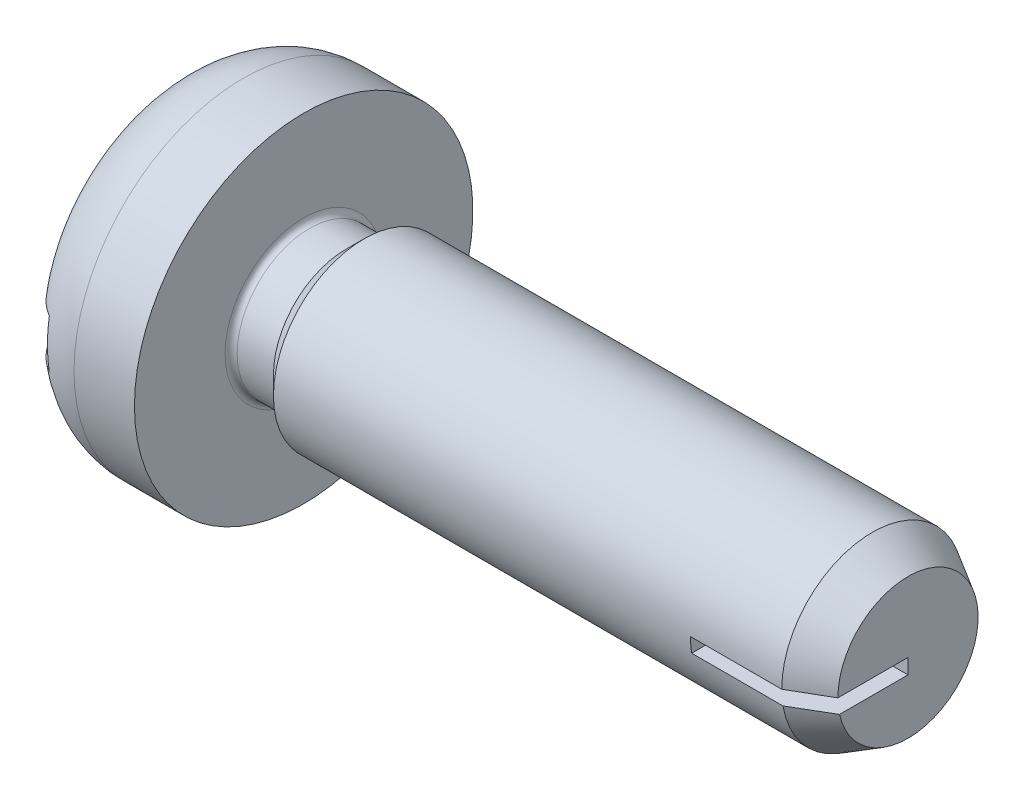
ISO-10303-21;
HEADER;
FILE_DESCRIPTION(('STEP AP214'),'2;1');
FILE_NAME('part.step','',(''),(''),'','','');
FILE_SCHEMA(('AUTOMOTIVE_DESIGN { 1 0 10303 214 1 1 1 1 }'));
ENDSEC;
DATA;
#1=APPLICATION_CONTEXT('core data for automotive mechanical design processes');
#2=APPLICATION_PROTOCOL_DEFINITION('international standard','automotive_design',2000,#1);
#3=PRODUCT_CONTEXT('',#1,'mechanical');
#4=PRODUCT('Part','Part','',(#3));
#5=PRODUCT_RELATED_PRODUCT_CATEGORY('part','',(#4));
#6=PRODUCT_DEFINITION_FORMATION('','',#4);
#7=PRODUCT_DEFINITION_CONTEXT('part definition',#1,'design');
#8=PRODUCT_DEFINITION('design','',#6,#7);
#9=PRODUCT_DEFINITION_SHAPE('','',#8);
#10=(LENGTH_UNIT() NAMED_UNIT(*) SI_UNIT(.MILLI.,.METRE.));
#11=(NAMED_UNIT(*) PLANE_ANGLE_UNIT() SI_UNIT($,.RADIAN.));
#12=(NAMED_UNIT(*) SI_UNIT($,.STERADIAN.) SOLID_ANGLE_UNIT());
#13=UNCERTAINTY_MEASURE_WITH_UNIT(LENGTH_MEASURE(1.E-05),#10,'distance_accuracy_value','');
#14=(GEOMETRIC_REPRESENTATION_CONTEXT(3) GLOBAL_UNCERTAINTY_ASSIGNED_CONTEXT((#13)) GLOBAL_UNIT_ASSIGNED_CONTEXT((#10,
#11,#12)) REPRESENTATION_CONTEXT('',''));
#15=CARTESIAN_POINT('',(0.,0.,0.));
#16=DIRECTION('',(0.,0.,1.));
#17=DIRECTION('',(1.,0.,0.));
#18=AXIS2_PLACEMENT_3D('',#15,#16,#17);
#19=CARTESIAN_POINT('',(0.,0.,0.));
#20=DIRECTION('',(-1.,0.,0.));
#21=DIRECTION('',(0.,0.,1.));
#22=AXIS2_PLACEMENT_3D('',#19,#20,#21);
#23=CYLINDRICAL_SURFACE('',#22,1.5);
#24=CARTESIAN_POINT('',(3.2,0.,0.));
#25=DIRECTION('',(-1.,0.,0.));
#26=DIRECTION('',(0.,0.,1.));
#27=AXIS2_PLACEMENT_3D('',#24,#25,#26);
#28=CIRCLE('',#27,1.5);
#29=CARTESIAN_POINT('',(3.2,0.,1.5));
#30=VERTEX_POINT('',#29);
#31=EDGE_CURVE('E176',#30,#30,#28,.T.);
#32=ORIENTED_EDGE('',*,*,#31,.F.);
#33=EDGE_LOOP('',(#32));
#34=FACE_BOUND('',#33,.T.);
#35=DIRECTION('',(-1.,0.,0.));
#36=VECTOR('',#35,1.);
#37=CARTESIAN_POINT('',(0.,0.,1.5));
#38=LINE('',#37,#36);
#39=CARTESIAN_POINT('',(11.6111027254266,0.,1.5));
#40=VERTEX_POINT('',#39);
#41=CARTESIAN_POINT('',(10.1,0.,1.5));
#42=VERTEX_POINT('',#41);
#43=EDGE_CURVE('E265',#40,#42,#38,.T.);
#44=ORIENTED_EDGE('',*,*,#43,.F.);
#45=CARTESIAN_POINT('',(11.6111027254266,0.,0.));
#46=DIRECTION('',(-1.,0.,0.));
#47=DIRECTION('',(0.,0.,1.));
#48=AXIS2_PLACEMENT_3D('',#45,#46,#47);
#49=CIRCLE('',#48,1.5);
#50=CARTESIAN_POINT('',(11.6111027254266,-0.25,1.4790199457749));
#51=VERTEX_POINT('',#50);
#52=EDGE_CURVE('E262',#40,#51,#49,.T.);
#53=ORIENTED_EDGE('',*,*,#52,.T.);
#54=DIRECTION('',(-1.,0.,0.));
#55=VECTOR('',#54,1.);
#56=CARTESIAN_POINT('',(0.,-0.250000000000002,1.4790199457749));
#57=LINE('',#56,#55);
#58=CARTESIAN_POINT('',(10.1,-0.25,1.4790199457749));
#59=VERTEX_POINT('',#58);
#60=EDGE_CURVE('E269',#59,#51,#57,.F.);
#61=ORIENTED_EDGE('',*,*,#60,.F.);
#62=CARTESIAN_POINT('',(10.1,0.,0.));
#63=DIRECTION('',(1.,0.,0.));
#64=DIRECTION('',(0.,0.,-1.));
#65=AXIS2_PLACEMENT_3D('',#62,#63,#64);
#66=CIRCLE('',#65,1.5);
#67=EDGE_CURVE('E47',#42,#59,#66,.T.);
#68=ORIENTED_EDGE('',*,*,#67,.F.);
#69=EDGE_LOOP('',(#44,#53,#61,#68));
#70=FACE_BOUND('',#69,.T.);
#71=ADVANCED_FACE('F74',(#34,#70),#23,.T.);
#72=CARTESIAN_POINT('',(11.6111027254266,0.,0.));
#73=DIRECTION('',(-1.,0.,0.));
#74=DIRECTION('',(0.,0.,1.));
#75=AXIS2_PLACEMENT_3D('',#72,#73,#74);
#76=CONICAL_SURFACE('',#75,1.5,0.523598775598292);
#77=ORIENTED_EDGE('',*,*,#52,.F.);
#78=DIRECTION('',(-0.866025403784442,0.,0.499999999999994));
#79=VECTOR('',#78,1.);
#80=CARTESIAN_POINT('',(14.2091789367799,0.,0.));
#81=LINE('',#80,#79);
#82=CARTESIAN_POINT('',(12.2,0.,1.16));
#83=VERTEX_POINT('',#82);
#84=EDGE_CURVE('E267',#40,#83,#81,.F.);
#85=ORIENTED_EDGE('',*,*,#84,.T.);
#86=CARTESIAN_POINT('',(12.2,0.,0.));
#87=DIRECTION('',(-1.,0.,0.));
#88=DIRECTION('',(0.,0.,1.));
#89=AXIS2_PLACEMENT_3D('',#86,#87,#88);
#90=CIRCLE('',#89,1.16);
#91=CARTESIAN_POINT('',(12.2,-0.25,1.13274004078606));
#92=VERTEX_POINT('',#91);
#93=EDGE_CURVE('E163',#83,#92,#90,.T.);
#94=ORIENTED_EDGE('',*,*,#93,.T.);
#95=CARTESIAN_POINT('',(13.4181418569732,-0.25,0.382203986386483));
#96=CARTESIAN_POINT('',(13.3972331951244,-0.25,0.396622432472531));
#97=CARTESIAN_POINT('',(13.3762173616021,-0.25,0.410883489403973));
#98=CARTESIAN_POINT('',(13.3340175932902,-0.25,0.439152569856273));
#99=CARTESIAN_POINT('',(13.3128336672864,-0.25,0.453160606478108));
#100=CARTESIAN_POINT('',(13.2491017012437,-0.25,0.494896164896426));
#101=CARTESIAN_POINT('',(13.2063676697051,-0.25,0.522339085516595));
#102=CARTESIAN_POINT('',(13.1206044012544,-0.25,0.576735461075967));
#103=CARTESIAN_POINT('',(13.0775752335605,-0.25,0.603689025716694));
#104=CARTESIAN_POINT('',(12.9913095492911,-0.25,0.657266142328872));
#105=CARTESIAN_POINT('',(12.9480730235488,-0.25,0.683889679520684));
#106=CARTESIAN_POINT('',(12.8218598791878,-0.25,0.761143065792754));
#107=CARTESIAN_POINT('',(12.7386947451298,-0.25,0.811464507635568));
#108=CARTESIAN_POINT('',(12.5720741029365,-0.25,0.91162472901041));
#109=CARTESIAN_POINT('',(12.488618591502,-0.25,0.961463503033985));
#110=CARTESIAN_POINT('',(12.23795252732,-0.25,1.11055290730823));
#111=CARTESIAN_POINT('',(12.0704761356872,-0.25,1.20935625450732));
#112=CARTESIAN_POINT('',(11.7752616348178,-0.25,1.3828718387951));
#113=CARTESIAN_POINT('',(11.6475908364412,-0.25,1.45769905707308));
#114=CARTESIAN_POINT('',(11.3921262060913,-0.25,1.60714336352689));
#115=CARTESIAN_POINT('',(11.2643323741095,-0.25,1.68176045168836));
#116=CARTESIAN_POINT('',(11.0087172173291,-0.25,1.83082709807698));
#117=CARTESIAN_POINT('',(10.8808959252065,-0.25,1.90527671238543));
#118=CARTESIAN_POINT('',(10.6251955577711,-0.25,2.05407620843158));
#119=CARTESIAN_POINT('',(10.4973164825464,-0.25,2.12842609032095));
#120=CARTESIAN_POINT('',(10.3694193114061,-0.25,2.20274480142775));
#121=B_SPLINE_CURVE_WITH_KNOTS('',3,(#95,#96,#97,#98,#99,#100,#101,#102,#103,#104,#105,#106,
#107,#108,#109,#110,#111,#112,#113,#114,#115,#116,#117,#118,#119,#120),.UNSPECIFIED.,.F.,.F.,(4,
2,2,2,2,2,2,2,2,2,2,2,4),(0.,0.076191962796667,0.152379969123876,0.304734924671152,
0.457055293432602,0.60938245909972,0.90099209824417,1.19260506147505,1.77594908814433,
2.2198978958494,2.66384673388621,3.10761381509469,3.55138022062236),.UNSPECIFIED.);
#122=EDGE_CURVE('E271',#92,#51,#121,.T.);
#123=ORIENTED_EDGE('',*,*,#122,.T.);
#124=EDGE_LOOP('',(#77,#85,#94,#123));
#125=FACE_BOUND('',#124,.T.);
#126=ADVANCED_FACE('F225',(#125),#76,.T.);
#127=CARTESIAN_POINT('',(12.2,1.5,0.));
#128=DIRECTION('',(-1.,0.,0.));
#129=DIRECTION('',(0.,0.,1.));
#130=AXIS2_PLACEMENT_3D('',#127,#128,#129);
#131=PLANE('',#130);
#132=DIRECTION('',(0.,0.,1.));
#133=VECTOR('',#132,1.);
#134=CARTESIAN_POINT('',(12.2,0.,0.));
#135=LINE('',#134,#133);
#136=CARTESIAN_POINT('',(12.2,0.,0.));
#137=VERTEX_POINT('',#136);
#138=EDGE_CURVE('E82',#137,#83,#135,.T.);
#139=ORIENTED_EDGE('',*,*,#138,.F.);
#140=DIRECTION('',(0.,1.,0.));
#141=VECTOR('',#140,1.);
#142=CARTESIAN_POINT('',(12.2,0.,0.));
#143=LINE('',#142,#141);
#144=CARTESIAN_POINT('',(12.2,-0.25,0.));
#145=VERTEX_POINT('',#144);
#146=EDGE_CURVE('E154',#145,#137,#143,.T.);
#147=ORIENTED_EDGE('',*,*,#146,.F.);
#148=DIRECTION('',(0.,0.,-1.));
#149=VECTOR('',#148,1.);
#150=CARTESIAN_POINT('',(12.2,-0.25,0.));
#151=LINE('',#150,#149);
#152=EDGE_CURVE('E164',#92,#145,#151,.T.);
#153=ORIENTED_EDGE('',*,*,#152,.F.);
#154=ORIENTED_EDGE('',*,*,#93,.F.);
#155=EDGE_LOOP('',(#139,#147,#153,#154));
#156=FACE_BOUND('',#155,.T.);
#157=ADVANCED_FACE('F76',(#156),#131,.F.);
#158=CARTESIAN_POINT('',(0.,0.,0.));
#159=DIRECTION('',(1.,0.,0.));
#160=DIRECTION('',(0.,0.,-1.));
#161=AXIS2_PLACEMENT_3D('',#158,#159,#160);
#162=PLANE('',#161);
#163=CARTESIAN_POINT('',(0.,0.,0.));
#164=DIRECTION('',(-1.,0.,0.));
#165=DIRECTION('',(0.,0.,1.));
#166=AXIS2_PLACEMENT_3D('',#163,#164,#165);
#167=CIRCLE('',#166,1.6);
#168=CARTESIAN_POINT('',(0.,0.4,1.54919333848297));
#169=VERTEX_POINT('',#168);
#170=CARTESIAN_POINT('',(0.,0.4,-1.54919333848297));
#171=VERTEX_POINT('',#170);
#172=EDGE_CURVE('E194',#169,#171,#167,.T.);
#173=ORIENTED_EDGE('',*,*,#172,.T.);
#174=DIRECTION('',(0.,0.,1.));
#175=VECTOR('',#174,1.);
#176=CARTESIAN_POINT('',(0.,0.4,0.));
#177=LINE('',#176,#175);
#178=EDGE_CURVE('E171',#171,#169,#177,.T.);
#179=ORIENTED_EDGE('',*,*,#178,.T.);
#180=EDGE_LOOP('',(#173,#179));
#181=FACE_BOUND('',#180,.T.);
#182=ADVANCED_FACE('F304',(#181),#162,.F.);
#183=CARTESIAN_POINT('',(3.2,0.,0.));
#184=DIRECTION('',(1.,0.,0.));
#185=DIRECTION('',(0.,0.,-1.));
#186=AXIS2_PLACEMENT_3D('',#183,#184,#185);
#187=CONICAL_SURFACE('',#186,1.5,0.78539816339745);
#188=CARTESIAN_POINT('',(2.9,0.,0.));
#189=DIRECTION('',(-1.,0.,0.));
#190=DIRECTION('',(0.,0.,1.));
#191=AXIS2_PLACEMENT_3D('',#188,#189,#190);
#192=CIRCLE('',#191,1.2);
#193=CARTESIAN_POINT('',(2.9,0.,1.2));
#194=VERTEX_POINT('',#193);
#195=EDGE_CURVE('E179',#194,#194,#192,.T.);
#196=ORIENTED_EDGE('',*,*,#195,.F.);
#197=EDGE_LOOP('',(#196));
#198=FACE_BOUND('',#197,.T.);
#199=ORIENTED_EDGE('',*,*,#31,.T.);
#200=EDGE_LOOP('',(#199));
#201=FACE_BOUND('',#200,.T.);
#202=ADVANCED_FACE('F300',(#198,#201),#187,.T.);
#203=CARTESIAN_POINT('',(0.,0.,0.));
#204=DIRECTION('',(-1.,0.,0.));
#205=DIRECTION('',(0.,0.,1.));
#206=AXIS2_PLACEMENT_3D('',#203,#204,#205);
#207=CYLINDRICAL_SURFACE('',#206,1.2);
#208=CARTESIAN_POINT('',(2.3,0.,0.));
#209=DIRECTION('',(-1.,0.,0.));
#210=DIRECTION('',(0.,0.,1.));
#211=AXIS2_PLACEMENT_3D('',#208,#209,#210);
#212=CIRCLE('',#211,1.2);
#213=CARTESIAN_POINT('',(2.3,0.,1.2));
#214=VERTEX_POINT('',#213);
#215=EDGE_CURVE('E182',#214,#214,#212,.T.);
#216=ORIENTED_EDGE('',*,*,#215,.F.);
#217=EDGE_LOOP('',(#216));
#218=FACE_BOUND('',#217,.T.);
#219=ORIENTED_EDGE('',*,*,#195,.T.);
#220=EDGE_LOOP('',(#219));
#221=FACE_BOUND('',#220,.T.);
#222=ADVANCED_FACE('F303',(#218,#221),#207,.T.);
#223=CARTESIAN_POINT('',(2.3,0.,0.));
#224=DIRECTION('',(-1.,0.,0.));
#225=DIRECTION('',(0.,0.,1.));
#226=AXIS2_PLACEMENT_3D('',#223,#224,#225);
#227=TOROIDAL_SURFACE('',#226,1.3,0.1);
#228=CARTESIAN_POINT('',(2.2,0.,0.));
#229=DIRECTION('',(-1.,0.,0.));
#230=DIRECTION('',(0.,0.,1.));
#231=AXIS2_PLACEMENT_3D('',#228,#229,#230);
#232=CIRCLE('',#231,1.3);
#233=CARTESIAN_POINT('',(2.2,0.,1.3));
#234=VERTEX_POINT('',#233);
#235=EDGE_CURVE('E185',#234,#234,#232,.T.);
#236=ORIENTED_EDGE('',*,*,#235,.F.);
#237=EDGE_LOOP('',(#236));
#238=FACE_BOUND('',#237,.T.);
#239=ORIENTED_EDGE('',*,*,#215,.T.);
#240=EDGE_LOOP('',(#239));
#241=FACE_BOUND('',#240,.T.);
#242=ADVANCED_FACE('F308',(#238,#241),#227,.F.);
#243=CARTESIAN_POINT('',(2.2,2.8,0.));
#244=DIRECTION('',(-1.,0.,0.));
#245=DIRECTION('',(0.,0.,1.));
#246=AXIS2_PLACEMENT_3D('',#243,#244,#245);
#247=PLANE('',#246);
#248=CARTESIAN_POINT('',(2.2,0.,0.));
#249=DIRECTION('',(-1.,0.,0.));
#250=DIRECTION('',(0.,0.,1.));
#251=AXIS2_PLACEMENT_3D('',#248,#249,#250);
#252=CIRCLE('',#251,2.8);
#253=CARTESIAN_POINT('',(2.2,0.,2.8));
#254=VERTEX_POINT('',#253);
#255=EDGE_CURVE('E188',#254,#254,#252,.T.);
#256=ORIENTED_EDGE('',*,*,#255,.F.);
#257=EDGE_LOOP('',(#256));
#258=FACE_BOUND('',#257,.T.);
#259=ORIENTED_EDGE('',*,*,#235,.T.);
#260=EDGE_LOOP('',(#259));
#261=FACE_BOUND('',#260,.T.);
#262=ADVANCED_FACE('F312',(#258,#261),#247,.F.);
#263=CARTESIAN_POINT('',(0.,0.,0.));
#264=DIRECTION('',(-1.,0.,0.));
#265=DIRECTION('',(0.,0.,1.));
#266=AXIS2_PLACEMENT_3D('',#263,#264,#265);
#267=CYLINDRICAL_SURFACE('',#266,2.8);
#268=CARTESIAN_POINT('',(1.2,0.,0.));
#269=DIRECTION('',(-1.,0.,0.));
#270=DIRECTION('',(0.,0.,1.));
#271=AXIS2_PLACEMENT_3D('',#268,#269,#270);
#272=CIRCLE('',#271,2.8);
#273=CARTESIAN_POINT('',(1.2,0.,2.8));
#274=VERTEX_POINT('',#273);
#275=EDGE_CURVE('E191',#274,#274,#272,.T.);
#276=ORIENTED_EDGE('',*,*,#275,.F.);
#277=EDGE_LOOP('',(#276));
#278=FACE_BOUND('',#277,.T.);
#279=ORIENTED_EDGE('',*,*,#255,.T.);
#280=EDGE_LOOP('',(#279));
#281=FACE_BOUND('',#280,.T.);
#282=ADVANCED_FACE('F315',(#278,#281),#267,.T.);
#283=CARTESIAN_POINT('',(1.2,0.,0.));
#284=DIRECTION('',(-1.,0.,0.));
#285=DIRECTION('',(0.,0.,1.));
#286=AXIS2_PLACEMENT_3D('',#283,#284,#285);
#287=TOROIDAL_SURFACE('',#286,1.6,1.2);
#288=CARTESIAN_POINT('',(0.6,0.,0.));
#289=DIRECTION('',(1.,0.,0.));
#290=DIRECTION('',(0.,0.,-1.));
#291=AXIS2_PLACEMENT_3D('',#288,#289,#290);
#292=CIRCLE('',#291,2.63923048454133);
#293=CARTESIAN_POINT('',(0.6,-0.4,-2.60874252285124));
#294=VERTEX_POINT('',#293);
#295=CARTESIAN_POINT('',(0.6,0.4,-2.60874252285124));
#296=VERTEX_POINT('',#295);
#297=EDGE_CURVE('E165',#294,#296,#292,.T.);
#298=ORIENTED_EDGE('',*,*,#297,.T.);
#299=CARTESIAN_POINT('',(1.2,0.400000000000001,0.));
#300=CARTESIAN_POINT('',(1.19800002214791,0.4,-0.001154666988746));
#301=CARTESIAN_POINT('',(1.19600002173453,0.4,-0.00230936827198685));
#302=CARTESIAN_POINT('',(1.07851992928599,0.39999999999999,-0.0701402646486405));
#303=CARTESIAN_POINT('',(0.963031267984319,0.399999999999998,-0.137031551756644));
#304=CARTESIAN_POINT('',(0.795628563220168,0.400000000000001,-0.246377030383382));
#305=CARTESIAN_POINT('',(0.74083243672943,0.4,-0.28429992284056));
#306=CARTESIAN_POINT('',(0.63430038544995,0.4,-0.364194759563667));
#307=CARTESIAN_POINT('',(0.582562679504242,0.4,-0.406164308913792));
#308=CARTESIAN_POINT('',(0.465619274422939,0.4,-0.510755553520023));
#309=CARTESIAN_POINT('',(0.402179968317139,0.4,-0.575408791769071));
#310=CARTESIAN_POINT('',(0.286317320035329,0.4,-0.714106368629468));
#311=CARTESIAN_POINT('',(0.233897735017201,0.4,-0.788153896456976));
#312=CARTESIAN_POINT('',(0.14279767016805,0.4,-0.945320815267216));
#313=CARTESIAN_POINT('',(0.104252175689026,0.4,-1.02851956723027));
#314=CARTESIAN_POINT('',(0.0443409897926616,0.4,-1.20092725682669));
#315=CARTESIAN_POINT('',(0.0229636760970162,0.4,-1.29013208413659));
#316=CARTESIAN_POINT('',(0.000858314142128928,0.4,-1.45827617527425));
#317=CARTESIAN_POINT('',(-0.00235235719654014,0.4,-1.53689338760907));
#318=CARTESIAN_POINT('',(0.00576054949018789,0.4,-1.69337597661971));
#319=CARTESIAN_POINT('',(0.0170759813004023,0.4,-1.77124175003649));
#320=CARTESIAN_POINT('',(0.0525610257882433,0.4,-1.91696976554088));
#321=CARTESIAN_POINT('',(0.0755565891226424,0.4,-1.98511979538448));
#322=CARTESIAN_POINT('',(0.13309350911141,0.4,-2.11635517467492));
#323=CARTESIAN_POINT('',(0.167631267407165,0.4,-2.17944209498869));
#324=CARTESIAN_POINT('',(0.245816751593075,0.4,-2.29633028651715));
#325=CARTESIAN_POINT('',(0.289080949151332,0.4,-2.35038843477028));
#326=CARTESIAN_POINT('',(0.384228337418144,0.4,-2.45030606079177));
#327=CARTESIAN_POINT('',(0.436111208507372,0.4,-2.49616584246169));
#328=CARTESIAN_POINT('',(0.545975816461641,0.4,-2.57751970417925));
#329=CARTESIAN_POINT('',(0.60382838626548,0.4,-2.61318831704896));
#330=CARTESIAN_POINT('',(0.724733603956864,0.4,-2.67419425683953));
#331=CARTESIAN_POINT('',(0.787785087346556,0.4,-2.69953388981805));
#332=CARTESIAN_POINT('',(0.916669466274505,0.4,-2.73894273624233));
#333=CARTESIAN_POINT('',(0.982470675322632,0.4,-2.75311557094148));
#334=CARTESIAN_POINT('',(1.11552556367097,0.4,-2.77017150485852));
#335=CARTESIAN_POINT('',(1.18277950768795,0.4,-2.77305252873677));
#336=CARTESIAN_POINT('',(1.31654922365038,0.4,-2.76743242821685));
#337=CARTESIAN_POINT('',(1.38306693540117,0.4,-2.75898086367105));
#338=CARTESIAN_POINT('',(1.4810331170306,0.4,-2.73804449298595));
#339=CARTESIAN_POINT('',(1.513411915861,0.4,-2.72967920848569));
#340=CARTESIAN_POINT('',(1.57735276527386,0.4,-2.71025505840743));
#341=CARTESIAN_POINT('',(1.60891478219583,0.4,-2.69919608201435));
#342=CARTESIAN_POINT('',(1.63997012604871,0.4,-2.68682286567693));
#343=B_SPLINE_CURVE_WITH_KNOTS('',3,(#299,#300,#301,#302,#303,#304,#305,#306,#307,#308,#309,
#310,#311,#312,#313,#314,#315,#316,#317,#318,#319,#320,#321,#322,#323,#324,#325,#326,#327,#328,
#329,#330,#331,#332,#333,#334,#335,#336,#337,#338,#339,#340,#341,#342),.UNSPECIFIED.,.F.,.F.,(4,
2,2,2,2,2,2,2,2,2,2,2,2,2,2,2,2,2,2,2,2,4),(0.,0.00692820323037702,0.40696237071656,
0.606725059472571,0.806370240836995,1.0771229989531,1.3479679206449,1.62138096078652,
1.89460875314781,2.12938467138207,2.36402898515866,2.57873345497456,2.79337105154169,
3.00008219626921,3.20678567692484,3.4097017610595,3.61257251711405,3.81353782319096,
4.01454006326571,4.21466613793811,4.31488940223492,4.41511679028676),.UNSPECIFIED.);
#344=EDGE_CURVE('E207',#296,#171,#343,.F.);
#345=ORIENTED_EDGE('',*,*,#344,.T.);
#346=ORIENTED_EDGE('',*,*,#172,.F.);
#347=CARTESIAN_POINT('',(1.2,0.400000000000001,0.));
#348=CARTESIAN_POINT('',(1.19800002214791,0.4,0.001154666988746));
#349=CARTESIAN_POINT('',(1.19600002173453,0.4,0.00230936827198685));
#350=CARTESIAN_POINT('',(1.07851992928599,0.39999999999999,0.0701402646486405));
#351=CARTESIAN_POINT('',(0.963031267984319,0.399999999999998,0.137031551756644));
#352=CARTESIAN_POINT('',(0.795628563220168,0.400000000000001,0.246377030383382));
#353=CARTESIAN_POINT('',(0.74083243672943,0.4,0.28429992284056));
#354=CARTESIAN_POINT('',(0.63430038544995,0.4,0.364194759563667));
#355=CARTESIAN_POINT('',(0.582562679504242,0.4,0.406164308913792));
#356=CARTESIAN_POINT('',(0.465619274422939,0.4,0.510755553520023));
#357=CARTESIAN_POINT('',(0.402179968317139,0.4,0.575408791769071));
#358=CARTESIAN_POINT('',(0.286317320035329,0.4,0.714106368629468));
#359=CARTESIAN_POINT('',(0.233897735017201,0.4,0.788153896456976));
#360=CARTESIAN_POINT('',(0.14279767016805,0.4,0.945320815267216));
#361=CARTESIAN_POINT('',(0.104252175689026,0.4,1.02851956723027));
#362=CARTESIAN_POINT('',(0.0443409897926616,0.4,1.20092725682669));
#363=CARTESIAN_POINT('',(0.0229636760970162,0.4,1.29013208413659));
#364=CARTESIAN_POINT('',(0.000858314142128928,0.4,1.45827617527425));
#365=CARTESIAN_POINT('',(-0.00235235719654014,0.4,1.53689338760907));
#366=CARTESIAN_POINT('',(0.00576054949018789,0.4,1.69337597661971));
#367=CARTESIAN_POINT('',(0.0170759813004023,0.4,1.77124175003649));
#368=CARTESIAN_POINT('',(0.0525610257882433,0.4,1.91696976554088));
#369=CARTESIAN_POINT('',(0.0755565891226424,0.4,1.98511979538448));
#370=CARTESIAN_POINT('',(0.13309350911141,0.4,2.11635517467492));
#371=CARTESIAN_POINT('',(0.167631267407165,0.4,2.17944209498869));
#372=CARTESIAN_POINT('',(0.245816751593075,0.4,2.29633028651715));
#373=CARTESIAN_POINT('',(0.289080949151332,0.4,2.35038843477028));
#374=CARTESIAN_POINT('',(0.384228337418144,0.4,2.45030606079177));
#375=CARTESIAN_POINT('',(0.436111208507372,0.4,2.49616584246169));
#376=CARTESIAN_POINT('',(0.545975816461641,0.4,2.57751970417925));
#377=CARTESIAN_POINT('',(0.60382838626548,0.4,2.61318831704896));
#378=CARTESIAN_POINT('',(0.724733603956864,0.4,2.67419425683953));
#379=CARTESIAN_POINT('',(0.787785087346556,0.4,2.69953388981805));
#380=CARTESIAN_POINT('',(0.916669466274505,0.4,2.73894273624233));
#381=CARTESIAN_POINT('',(0.982470675322632,0.4,2.75311557094148));
#382=CARTESIAN_POINT('',(1.11552556367097,0.4,2.77017150485852));
#383=CARTESIAN_POINT('',(1.18277950768795,0.4,2.77305252873677));
#384=CARTESIAN_POINT('',(1.31654922365038,0.4,2.76743242821685));
#385=CARTESIAN_POINT('',(1.38306693540117,0.4,2.75898086367105));
#386=CARTESIAN_POINT('',(1.4810331170306,0.4,2.73804449298595));
#387=CARTESIAN_POINT('',(1.513411915861,0.4,2.72967920848569));
#388=CARTESIAN_POINT('',(1.57735276527386,0.4,2.71025505840743));
#389=CARTESIAN_POINT('',(1.60891478219583,0.4,2.69919608201435));
#390=CARTESIAN_POINT('',(1.63997012604871,0.4,2.68682286567693));
#391=B_SPLINE_CURVE_WITH_KNOTS('',3,(#347,#348,#349,#350,#351,#352,#353,#354,#355,#356,#357,
#358,#359,#360,#361,#362,#363,#364,#365,#366,#367,#368,#369,#370,#371,#372,#373,#374,#375,#376,
#377,#378,#379,#380,#381,#382,#383,#384,#385,#386,#387,#388,#389,#390),.UNSPECIFIED.,.F.,.F.,(4,
2,2,2,2,2,2,2,2,2,2,2,2,2,2,2,2,2,2,2,2,4),(0.,0.00692820323037702,0.40696237071656,
0.606725059472571,0.806370240836995,1.0771229989531,1.3479679206449,1.62138096078652,
1.89460875314781,2.12938467138207,2.36402898515866,2.57873345497456,2.79337105154169,
3.00008219626921,3.20678567692484,3.4097017610595,3.61257251711405,3.81353782319096,
4.01454006326571,4.21466613793811,4.31488940223492,4.41511679028676),.UNSPECIFIED.);
#392=CARTESIAN_POINT('',(0.6,0.4,2.60874252285124));
#393=VERTEX_POINT('',#392);
#394=EDGE_CURVE('E198',#169,#393,#391,.T.);
#395=ORIENTED_EDGE('',*,*,#394,.T.);
#396=CARTESIAN_POINT('',(0.6,-0.4,2.60874252285124));
#397=VERTEX_POINT('',#396);
#398=EDGE_CURVE('E168',#393,#397,#292,.T.);
#399=ORIENTED_EDGE('',*,*,#398,.T.);
#400=CARTESIAN_POINT('',(1.2,-0.400000000000001,0.));
#401=CARTESIAN_POINT('',(1.19800002214791,-0.4,0.001154666988746));
#402=CARTESIAN_POINT('',(1.19600002173453,-0.4,0.00230936827198685));
#403=CARTESIAN_POINT('',(1.07851992928599,-0.39999999999999,0.0701402646486405));
#404=CARTESIAN_POINT('',(0.963031267984319,-0.399999999999998,0.137031551756644));
#405=CARTESIAN_POINT('',(0.795628563220168,-0.400000000000001,0.246377030383382));
#406=CARTESIAN_POINT('',(0.74083243672943,-0.4,0.28429992284056));
#407=CARTESIAN_POINT('',(0.63430038544995,-0.4,0.364194759563667));
#408=CARTESIAN_POINT('',(0.582562679504242,-0.4,0.406164308913792));
#409=CARTESIAN_POINT('',(0.465619274422939,-0.4,0.510755553520023));
#410=CARTESIAN_POINT('',(0.402179968317139,-0.4,0.575408791769071));
#411=CARTESIAN_POINT('',(0.286317320035329,-0.4,0.714106368629468));
#412=CARTESIAN_POINT('',(0.233897735017201,-0.4,0.788153896456976));
#413=CARTESIAN_POINT('',(0.14279767016805,-0.4,0.945320815267216));
#414=CARTESIAN_POINT('',(0.104252175689026,-0.4,1.02851956723027));
#415=CARTESIAN_POINT('',(0.0443409897926616,-0.4,1.20092725682669));
#416=CARTESIAN_POINT('',(0.0229636760970162,-0.4,1.29013208413659));
#417=CARTESIAN_POINT('',(0.000858314142128928,-0.4,1.45827617527425));
#418=CARTESIAN_POINT('',(-0.00235235719654014,-0.4,1.53689338760907));
#419=CARTESIAN_POINT('',(0.00576054949018789,-0.4,1.69337597661971));
#420=CARTESIAN_POINT('',(0.0170759813004023,-0.4,1.77124175003649));
#421=CARTESIAN_POINT('',(0.0525610257882433,-0.4,1.91696976554088));
#422=CARTESIAN_POINT('',(0.0755565891226424,-0.4,1.98511979538448));
#423=CARTESIAN_POINT('',(0.13309350911141,-0.4,2.11635517467492));
#424=CARTESIAN_POINT('',(0.167631267407165,-0.4,2.17944209498869));
#425=CARTESIAN_POINT('',(0.245816751593075,-0.4,2.29633028651715));
#426=CARTESIAN_POINT('',(0.289080949151332,-0.4,2.35038843477028));
#427=CARTESIAN_POINT('',(0.384228337418144,-0.4,2.45030606079177));
#428=CARTESIAN_POINT('',(0.436111208507372,-0.4,2.49616584246169));
#429=CARTESIAN_POINT('',(0.545975816461641,-0.4,2.57751970417925));
#430=CARTESIAN_POINT('',(0.60382838626548,-0.4,2.61318831704896));
#431=CARTESIAN_POINT('',(0.724733603956864,-0.4,2.67419425683953));
#432=CARTESIAN_POINT('',(0.787785087346556,-0.4,2.69953388981805));
#433=CARTESIAN_POINT('',(0.916669466274505,-0.4,2.73894273624233));
#434=CARTESIAN_POINT('',(0.982470675322632,-0.4,2.75311557094148));
#435=CARTESIAN_POINT('',(1.11552556367097,-0.4,2.77017150485852));
#436=CARTESIAN_POINT('',(1.18277950768795,-0.4,2.77305252873677));
#437=CARTESIAN_POINT('',(1.31654922365038,-0.4,2.76743242821685));
#438=CARTESIAN_POINT('',(1.38306693540117,-0.4,2.75898086367105));
#439=CARTESIAN_POINT('',(1.4810331170306,-0.4,2.73804449298595));
#440=CARTESIAN_POINT('',(1.513411915861,-0.4,2.72967920848569));
#441=CARTESIAN_POINT('',(1.57735276527386,-0.4,2.71025505840743));
#442=CARTESIAN_POINT('',(1.60891478219583,-0.4,2.69919608201435));
#443=CARTESIAN_POINT('',(1.63997012604871,-0.4,2.68682286567693));
#444=B_SPLINE_CURVE_WITH_KNOTS('',3,(#400,#401,#402,#403,#404,#405,#406,#407,#408,#409,#410,
#411,#412,#413,#414,#415,#416,#417,#418,#419,#420,#421,#422,#423,#424,#425,#426,#427,#428,#429,
#430,#431,#432,#433,#434,#435,#436,#437,#438,#439,#440,#441,#442,#443),.UNSPECIFIED.,.F.,.F.,(4,
2,2,2,2,2,2,2,2,2,2,2,2,2,2,2,2,2,2,2,2,4),(0.,0.00692820323037702,0.40696237071656,
0.606725059472571,0.806370240836995,1.0771229989531,1.3479679206449,1.62138096078652,
1.89460875314781,2.12938467138207,2.36402898515866,2.57873345497456,2.79337105154169,
3.00008219626921,3.20678567692484,3.4097017610595,3.61257251711405,3.81353782319096,
4.01454006326571,4.21466613793811,4.31488940223492,4.41511679028676),.UNSPECIFIED.);
#445=CARTESIAN_POINT('',(0.,-0.4,1.54919333848297));
#446=VERTEX_POINT('',#445);
#447=EDGE_CURVE('E238',#397,#446,#444,.F.);
#448=ORIENTED_EDGE('',*,*,#447,.T.);
#449=CARTESIAN_POINT('',(0.,-0.4,-1.54919333848297));
#450=VERTEX_POINT('',#449);
#451=EDGE_CURVE('E197',#450,#446,#167,.T.);
#452=ORIENTED_EDGE('',*,*,#451,.F.);
#453=CARTESIAN_POINT('',(1.2,-0.400000000000001,0.));
#454=CARTESIAN_POINT('',(1.19800002214791,-0.4,-0.001154666988746));
#455=CARTESIAN_POINT('',(1.19600002173453,-0.4,-0.00230936827198685));
#456=CARTESIAN_POINT('',(1.07851992928599,-0.39999999999999,-0.0701402646486405));
#457=CARTESIAN_POINT('',(0.963031267984319,-0.399999999999998,-0.137031551756644));
#458=CARTESIAN_POINT('',(0.795628563220168,-0.400000000000001,-0.246377030383382));
#459=CARTESIAN_POINT('',(0.74083243672943,-0.4,-0.28429992284056));
#460=CARTESIAN_POINT('',(0.63430038544995,-0.4,-0.364194759563667));
#461=CARTESIAN_POINT('',(0.582562679504242,-0.4,-0.406164308913792));
#462=CARTESIAN_POINT('',(0.465619274422939,-0.4,-0.510755553520023));
#463=CARTESIAN_POINT('',(0.402179968317139,-0.4,-0.575408791769071));
#464=CARTESIAN_POINT('',(0.286317320035329,-0.4,-0.714106368629468));
#465=CARTESIAN_POINT('',(0.233897735017201,-0.4,-0.788153896456976));
#466=CARTESIAN_POINT('',(0.14279767016805,-0.4,-0.945320815267216));
#467=CARTESIAN_POINT('',(0.104252175689026,-0.4,-1.02851956723027));
#468=CARTESIAN_POINT('',(0.0443409897926616,-0.4,-1.20092725682669));
#469=CARTESIAN_POINT('',(0.0229636760970162,-0.4,-1.29013208413659));
#470=CARTESIAN_POINT('',(0.000858314142128928,-0.4,-1.45827617527425));
#471=CARTESIAN_POINT('',(-0.00235235719654014,-0.4,-1.53689338760907));
#472=CARTESIAN_POINT('',(0.00576054949018789,-0.4,-1.69337597661971));
#473=CARTESIAN_POINT('',(0.0170759813004023,-0.4,-1.77124175003649));
#474=CARTESIAN_POINT('',(0.0525610257882433,-0.4,-1.91696976554088));
#475=CARTESIAN_POINT('',(0.0755565891226424,-0.4,-1.98511979538448));
#476=CARTESIAN_POINT('',(0.13309350911141,-0.4,-2.11635517467492));
#477=CARTESIAN_POINT('',(0.167631267407165,-0.4,-2.17944209498869));
#478=CARTESIAN_POINT('',(0.245816751593075,-0.4,-2.29633028651715));
#479=CARTESIAN_POINT('',(0.289080949151332,-0.4,-2.35038843477028));
#480=CARTESIAN_POINT('',(0.384228337418144,-0.4,-2.45030606079177));
#481=CARTESIAN_POINT('',(0.436111208507372,-0.4,-2.49616584246169));
#482=CARTESIAN_POINT('',(0.545975816461641,-0.4,-2.57751970417925));
#483=CARTESIAN_POINT('',(0.60382838626548,-0.4,-2.61318831704896));
#484=CARTESIAN_POINT('',(0.724733603956864,-0.4,-2.67419425683953));
#485=CARTESIAN_POINT('',(0.787785087346556,-0.4,-2.69953388981805));
#486=CARTESIAN_POINT('',(0.916669466274505,-0.4,-2.73894273624233));
#487=CARTESIAN_POINT('',(0.982470675322632,-0.4,-2.75311557094148));
#488=CARTESIAN_POINT('',(1.11552556367097,-0.4,-2.77017150485852));
#489=CARTESIAN_POINT('',(1.18277950768795,-0.4,-2.77305252873677));
#490=CARTESIAN_POINT('',(1.31654922365038,-0.4,-2.76743242821685));
#491=CARTESIAN_POINT('',(1.38306693540117,-0.4,-2.75898086367105));
#492=CARTESIAN_POINT('',(1.4810331170306,-0.4,-2.73804449298595));
#493=CARTESIAN_POINT('',(1.513411915861,-0.4,-2.72967920848569));
#494=CARTESIAN_POINT('',(1.57735276527386,-0.4,-2.71025505840743));
#495=CARTESIAN_POINT('',(1.60891478219583,-0.4,-2.69919608201435));
#496=CARTESIAN_POINT('',(1.63997012604871,-0.4,-2.68682286567693));
#497=B_SPLINE_CURVE_WITH_KNOTS('',3,(#453,#454,#455,#456,#457,#458,#459,#460,#461,#462,#463,
#464,#465,#466,#467,#468,#469,#470,#471,#472,#473,#474,#475,#476,#477,#478,#479,#480,#481,#482,
#483,#484,#485,#486,#487,#488,#489,#490,#491,#492,#493,#494,#495,#496),.UNSPECIFIED.,.F.,.F.,(4,
2,2,2,2,2,2,2,2,2,2,2,2,2,2,2,2,2,2,2,2,4),(0.,0.00692820323037702,0.40696237071656,
0.606725059472571,0.806370240836995,1.0771229989531,1.3479679206449,1.62138096078652,
1.89460875314781,2.12938467138207,2.36402898515866,2.57873345497456,2.79337105154169,
3.00008219626921,3.20678567692484,3.4097017610595,3.61257251711405,3.81353782319096,
4.01454006326571,4.21466613793811,4.31488940223492,4.41511679028676),.UNSPECIFIED.);
#498=EDGE_CURVE('E97',#450,#294,#497,.T.);
#499=ORIENTED_EDGE('',*,*,#498,.T.);
#500=EDGE_LOOP('',(#298,#345,#346,#395,#399,#448,#452,#499));
#501=FACE_BOUND('',#500,.T.);
#502=ORIENTED_EDGE('',*,*,#275,.T.);
#503=EDGE_LOOP('',(#502));
#504=FACE_BOUND('',#503,.T.);
#505=ADVANCED_FACE('F213',(#501,#504),#287,.T.);
#506=ORIENTED_EDGE('',*,*,#451,.T.);
#507=DIRECTION('',(0.,0.,-1.));
#508=VECTOR('',#507,1.);
#509=CARTESIAN_POINT('',(0.,-0.4,0.));
#510=LINE('',#509,#508);
#511=EDGE_CURVE('E174',#446,#450,#510,.T.);
#512=ORIENTED_EDGE('',*,*,#511,.T.);
#513=EDGE_LOOP('',(#506,#512));
#514=FACE_BOUND('',#513,.T.);
#515=ADVANCED_FACE('F231',(#514),#162,.F.);
#516=CARTESIAN_POINT('',(0.6,0.4,-2.8));
#517=DIRECTION('',(1.,0.,0.));
#518=DIRECTION('',(0.,0.,-1.));
#519=AXIS2_PLACEMENT_3D('',#516,#517,#518);
#520=PLANE('',#519);
#521=DIRECTION('',(0.,0.,1.));
#522=VECTOR('',#521,1.);
#523=CARTESIAN_POINT('',(0.6,0.4,-2.8));
#524=LINE('',#523,#522);
#525=EDGE_CURVE('E253',#296,#393,#524,.T.);
#526=ORIENTED_EDGE('',*,*,#525,.F.);
#527=ORIENTED_EDGE('',*,*,#297,.F.);
#528=DIRECTION('',(0.,0.,1.));
#529=VECTOR('',#528,1.);
#530=CARTESIAN_POINT('',(0.6,-0.4,-2.8));
#531=LINE('',#530,#529);
#532=EDGE_CURVE('E256',#294,#397,#531,.T.);
#533=ORIENTED_EDGE('',*,*,#532,.T.);
#534=ORIENTED_EDGE('',*,*,#398,.F.);
#535=EDGE_LOOP('',(#526,#527,#533,#534));
#536=FACE_BOUND('',#535,.T.);
#537=ADVANCED_FACE('F223',(#536),#520,.F.);
#538=CARTESIAN_POINT('',(0.,0.4,-2.8));
#539=DIRECTION('',(0.,1.,0.));
#540=DIRECTION('',(0.,0.,1.));
#541=AXIS2_PLACEMENT_3D('',#538,#539,#540);
#542=PLANE('',#541);
#543=ORIENTED_EDGE('',*,*,#178,.F.);
#544=ORIENTED_EDGE('',*,*,#344,.F.);
#545=ORIENTED_EDGE('',*,*,#525,.T.);
#546=ORIENTED_EDGE('',*,*,#394,.F.);
#547=EDGE_LOOP('',(#543,#544,#545,#546));
#548=FACE_BOUND('',#547,.T.);
#549=ADVANCED_FACE('F217',(#548),#542,.F.);
#550=CARTESIAN_POINT('',(0.,-0.4,-2.8));
#551=DIRECTION('',(0.,-1.,0.));
#552=DIRECTION('',(0.,0.,-1.));
#553=AXIS2_PLACEMENT_3D('',#550,#551,#552);
#554=PLANE('',#553);
#555=ORIENTED_EDGE('',*,*,#511,.F.);
#556=ORIENTED_EDGE('',*,*,#447,.F.);
#557=ORIENTED_EDGE('',*,*,#532,.F.);
#558=ORIENTED_EDGE('',*,*,#498,.F.);
#559=EDGE_LOOP('',(#555,#556,#557,#558));
#560=FACE_BOUND('',#559,.T.);
#561=ADVANCED_FACE('F222',(#560),#554,.F.);
#562=CARTESIAN_POINT('',(10.1,0.,2.8));
#563=DIRECTION('',(1.,0.,0.));
#564=DIRECTION('',(0.,0.,-1.));
#565=AXIS2_PLACEMENT_3D('',#562,#563,#564);
#566=PLANE('',#565);
#567=ORIENTED_EDGE('',*,*,#67,.T.);
#568=DIRECTION('',(0.,0.,-1.));
#569=VECTOR('',#568,1.);
#570=CARTESIAN_POINT('',(10.1,-0.25,2.8));
#571=LINE('',#570,#569);
#572=CARTESIAN_POINT('',(10.1,-0.25,0.));
#573=VERTEX_POINT('',#572);
#574=EDGE_CURVE('E447',#59,#573,#571,.T.);
#575=ORIENTED_EDGE('',*,*,#574,.T.);
#576=DIRECTION('',(0.,-1.,0.));
#577=VECTOR('',#576,1.);
#578=CARTESIAN_POINT('',(10.1,0.,0.));
#579=LINE('',#578,#577);
#580=CARTESIAN_POINT('',(10.1,0.,0.));
#581=VERTEX_POINT('',#580);
#582=EDGE_CURVE('E153',#581,#573,#579,.T.);
#583=ORIENTED_EDGE('',*,*,#582,.F.);
#584=DIRECTION('',(0.,0.,-1.));
#585=VECTOR('',#584,1.);
#586=CARTESIAN_POINT('',(10.1,0.,2.8));
#587=LINE('',#586,#585);
#588=EDGE_CURVE('E151',#42,#581,#587,.T.);
#589=ORIENTED_EDGE('',*,*,#588,.F.);
#590=EDGE_LOOP('',(#567,#575,#583,#589));
#591=FACE_BOUND('',#590,.T.);
#592=ADVANCED_FACE('F235',(#591),#566,.T.);
#593=CARTESIAN_POINT('',(12.2,0.,2.8));
#594=DIRECTION('',(0.,-1.,0.));
#595=DIRECTION('',(1.,0.,0.));
#596=AXIS2_PLACEMENT_3D('',#593,#594,#595);
#597=PLANE('',#596);
#598=ORIENTED_EDGE('',*,*,#43,.T.);
#599=ORIENTED_EDGE('',*,*,#588,.T.);
#600=DIRECTION('',(-1.,0.,0.));
#601=VECTOR('',#600,1.);
#602=CARTESIAN_POINT('',(12.2,0.,0.));
#603=LINE('',#602,#601);
#604=EDGE_CURVE('E146',#137,#581,#603,.T.);
#605=ORIENTED_EDGE('',*,*,#604,.F.);
#606=ORIENTED_EDGE('',*,*,#138,.T.);
#607=ORIENTED_EDGE('',*,*,#84,.F.);
#608=EDGE_LOOP('',(#598,#599,#605,#606,#607));
#609=FACE_BOUND('',#608,.T.);
#610=ADVANCED_FACE('F147',(#609),#597,.T.);
#611=CARTESIAN_POINT('',(12.2,-0.25,2.8));
#612=DIRECTION('',(0.,1.,0.));
#613=DIRECTION('',(-1.,0.,0.));
#614=AXIS2_PLACEMENT_3D('',#611,#612,#613);
#615=PLANE('',#614);
#616=ORIENTED_EDGE('',*,*,#60,.T.);
#617=ORIENTED_EDGE('',*,*,#122,.F.);
#618=ORIENTED_EDGE('',*,*,#152,.T.);
#619=DIRECTION('',(1.,0.,0.));
#620=VECTOR('',#619,1.);
#621=CARTESIAN_POINT('',(12.2,-0.25,0.));
#622=LINE('',#621,#620);
#623=EDGE_CURVE('E89',#573,#145,#622,.T.);
#624=ORIENTED_EDGE('',*,*,#623,.F.);
#625=ORIENTED_EDGE('',*,*,#574,.F.);
#626=EDGE_LOOP('',(#616,#617,#618,#624,#625));
#627=FACE_BOUND('',#626,.T.);
#628=ADVANCED_FACE('F280',(#627),#615,.T.);
#629=CARTESIAN_POINT('',(12.2,0.,0.));
#630=DIRECTION('',(0.,0.,-1.));
#631=DIRECTION('',(-1.,0.,0.));
#632=AXIS2_PLACEMENT_3D('',#629,#630,#631);
#633=PLANE('',#632);
#634=ORIENTED_EDGE('',*,*,#146,.T.);
#635=ORIENTED_EDGE('',*,*,#604,.T.);
#636=ORIENTED_EDGE('',*,*,#582,.T.);
#637=ORIENTED_EDGE('',*,*,#623,.T.);
#638=EDGE_LOOP('',(#634,#635,#636,#637));
#639=FACE_BOUND('',#638,.T.);
#640=ADVANCED_FACE('F157',(#639),#633,.F.);
#641=CLOSED_SHELL('',(#71,#126,#157,#182,#202,#222,#242,#262,#282,#505,#515,#537,#549,#561,#592,
#610,#628,#640));
#642=MANIFOLD_SOLID_BREP('B6',#641);
#643=ADVANCED_BREP_SHAPE_REPRESENTATION('',(#18,#642),#14);
#644=SHAPE_DEFINITION_REPRESENTATION(#9,#643);
ENDSEC;
END-ISO-10303-21;
